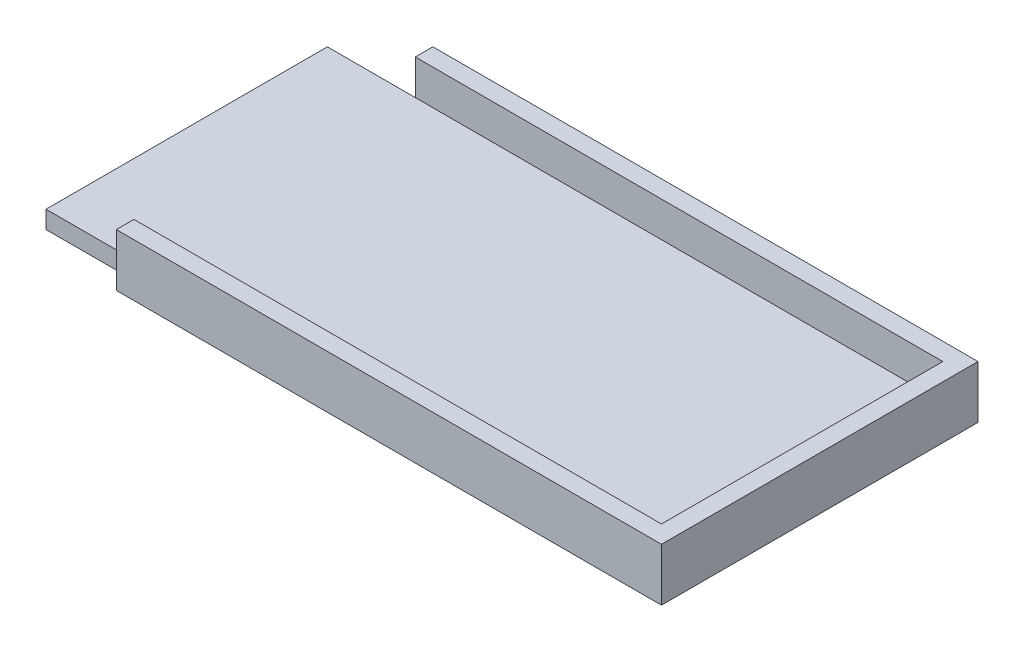
ISO-10303-21;
HEADER;
FILE_DESCRIPTION(('STEP AP214'),'2;1');
FILE_NAME('part.step','',(''),(''),'','','');
FILE_SCHEMA(('AUTOMOTIVE_DESIGN { 1 0 10303 214 1 1 1 1 }'));
ENDSEC;
DATA;
#1=APPLICATION_CONTEXT('core data for automotive mechanical design processes');
#2=APPLICATION_PROTOCOL_DEFINITION('international standard','automotive_design',2000,#1);
#3=PRODUCT_CONTEXT('',#1,'mechanical');
#4=PRODUCT('Part','Part','',(#3));
#5=PRODUCT_RELATED_PRODUCT_CATEGORY('part','',(#4));
#6=PRODUCT_DEFINITION_FORMATION('','',#4);
#7=PRODUCT_DEFINITION_CONTEXT('part definition',#1,'design');
#8=PRODUCT_DEFINITION('design','',#6,#7);
#9=PRODUCT_DEFINITION_SHAPE('','',#8);
#10=(LENGTH_UNIT() NAMED_UNIT(*) SI_UNIT(.MILLI.,.METRE.));
#11=(NAMED_UNIT(*) PLANE_ANGLE_UNIT() SI_UNIT($,.RADIAN.));
#12=(NAMED_UNIT(*) SI_UNIT($,.STERADIAN.) SOLID_ANGLE_UNIT());
#13=UNCERTAINTY_MEASURE_WITH_UNIT(LENGTH_MEASURE(1.E-05),#10,'distance_accuracy_value','');
#14=(GEOMETRIC_REPRESENTATION_CONTEXT(3) GLOBAL_UNCERTAINTY_ASSIGNED_CONTEXT((#13)) GLOBAL_UNIT_ASSIGNED_CONTEXT((#10,
#11,#12)) REPRESENTATION_CONTEXT('',''));
#15=CARTESIAN_POINT('',(0.,0.,0.));
#16=DIRECTION('',(0.,0.,1.));
#17=DIRECTION('',(1.,0.,0.));
#18=AXIS2_PLACEMENT_3D('',#15,#16,#17);
#19=CARTESIAN_POINT('',(-30.,2.,16.));
#20=DIRECTION('',(1.,0.,0.));
#21=DIRECTION('',(0.,0.,-1.));
#22=AXIS2_PLACEMENT_3D('',#19,#20,#21);
#23=PLANE('',#22);
#24=DIRECTION('',(0.,-1.,0.));
#25=VECTOR('',#24,1.);
#26=CARTESIAN_POINT('',(-30.,2.,-16.));
#27=LINE('',#26,#25);
#28=CARTESIAN_POINT('',(-30.,2.,-16.));
#29=VERTEX_POINT('',#28);
#30=CARTESIAN_POINT('',(-30.,0.,-16.));
#31=VERTEX_POINT('',#30);
#32=EDGE_CURVE('E194',#29,#31,#27,.T.);
#33=ORIENTED_EDGE('',*,*,#32,.F.);
#34=DIRECTION('',(0.,-1.,0.));
#35=VECTOR('',#34,1.);
#36=CARTESIAN_POINT('',(-30.,81.6937933157397,-16.));
#37=LINE('',#36,#35);
#38=CARTESIAN_POINT('',(-30.,6.00000000000001,-16.));
#39=VERTEX_POINT('',#38);
#40=EDGE_CURVE('E160',#39,#29,#37,.T.);
#41=ORIENTED_EDGE('',*,*,#40,.F.);
#42=DIRECTION('',(0.,0.,-1.));
#43=VECTOR('',#42,1.);
#44=CARTESIAN_POINT('',(-30.,6.00000000000001,-16.));
#45=LINE('',#44,#43);
#46=CARTESIAN_POINT('',(-30.,6.00000000000001,-18.));
#47=VERTEX_POINT('',#46);
#48=EDGE_CURVE('E163',#39,#47,#45,.T.);
#49=ORIENTED_EDGE('',*,*,#48,.T.);
#50=DIRECTION('',(0.,-1.,0.));
#51=VECTOR('',#50,1.);
#52=CARTESIAN_POINT('',(-30.,81.6937933157397,-18.));
#53=LINE('',#52,#51);
#54=CARTESIAN_POINT('',(-30.,0.,-18.));
#55=VERTEX_POINT('',#54);
#56=EDGE_CURVE('E164',#47,#55,#53,.T.);
#57=ORIENTED_EDGE('',*,*,#56,.T.);
#58=DIRECTION('',(0.,0.,1.));
#59=VECTOR('',#58,1.);
#60=CARTESIAN_POINT('',(-30.,0.,16.));
#61=LINE('',#60,#59);
#62=EDGE_CURVE('E39',#55,#31,#61,.T.);
#63=ORIENTED_EDGE('',*,*,#62,.T.);
#64=EDGE_LOOP('',(#33,#41,#49,#57,#63));
#65=FACE_BOUND('',#64,.T.);
#66=ADVANCED_FACE('F35',(#65),#23,.F.);
#67=DIRECTION('',(0.,-1.,0.));
#68=VECTOR('',#67,1.);
#69=CARTESIAN_POINT('',(-30.,81.6937933157397,16.));
#70=LINE('',#69,#68);
#71=CARTESIAN_POINT('',(-30.,6.00000000000001,16.));
#72=VERTEX_POINT('',#71);
#73=CARTESIAN_POINT('',(-30.,2.,16.));
#74=VERTEX_POINT('',#73);
#75=EDGE_CURVE('E140',#72,#74,#70,.T.);
#76=ORIENTED_EDGE('',*,*,#75,.T.);
#77=DIRECTION('',(0.,-1.,0.));
#78=VECTOR('',#77,1.);
#79=CARTESIAN_POINT('',(-30.,2.,16.));
#80=LINE('',#79,#78);
#81=CARTESIAN_POINT('',(-30.,0.,16.));
#82=VERTEX_POINT('',#81);
#83=EDGE_CURVE('E116',#74,#82,#80,.T.);
#84=ORIENTED_EDGE('',*,*,#83,.T.);
#85=CARTESIAN_POINT('',(-30.,0.,18.));
#86=VERTEX_POINT('',#85);
#87=EDGE_CURVE('E147',#82,#86,#61,.T.);
#88=ORIENTED_EDGE('',*,*,#87,.T.);
#89=DIRECTION('',(0.,-1.,0.));
#90=VECTOR('',#89,1.);
#91=CARTESIAN_POINT('',(-30.,81.6937933157397,18.));
#92=LINE('',#91,#90);
#93=CARTESIAN_POINT('',(-30.,6.00000000000001,18.));
#94=VERTEX_POINT('',#93);
#95=EDGE_CURVE('E149',#94,#86,#92,.T.);
#96=ORIENTED_EDGE('',*,*,#95,.F.);
#97=DIRECTION('',(0.,0.,-1.));
#98=VECTOR('',#97,1.);
#99=CARTESIAN_POINT('',(-30.,6.00000000000001,16.));
#100=LINE('',#99,#98);
#101=EDGE_CURVE('E146',#94,#72,#100,.T.);
#102=ORIENTED_EDGE('',*,*,#101,.T.);
#103=EDGE_LOOP('',(#76,#84,#88,#96,#102));
#104=FACE_BOUND('',#103,.T.);
#105=ADVANCED_FACE('F37',(#104),#23,.F.);
#106=CARTESIAN_POINT('',(0.,2.,0.));
#107=DIRECTION('',(0.,1.,0.));
#108=DIRECTION('',(0.,0.,1.));
#109=AXIS2_PLACEMENT_3D('',#106,#107,#108);
#110=PLANE('',#109);
#111=DIRECTION('',(-1.,0.,0.));
#112=VECTOR('',#111,1.);
#113=CARTESIAN_POINT('',(30.,2.,-16.));
#114=LINE('',#113,#112);
#115=CARTESIAN_POINT('',(30.,2.,-16.));
#116=VERTEX_POINT('',#115);
#117=EDGE_CURVE('E12',#116,#29,#114,.T.);
#118=ORIENTED_EDGE('',*,*,#117,.T.);
#119=DIRECTION('',(1.,0.,0.));
#120=VECTOR('',#119,1.);
#121=CARTESIAN_POINT('',(-30.,2.,-16.));
#122=LINE('',#121,#120);
#123=CARTESIAN_POINT('',(-40.,2.,-16.));
#124=VERTEX_POINT('',#123);
#125=EDGE_CURVE('E124',#124,#29,#122,.T.);
#126=ORIENTED_EDGE('',*,*,#125,.F.);
#127=DIRECTION('',(0.,0.,-1.));
#128=VECTOR('',#127,1.);
#129=CARTESIAN_POINT('',(-40.,2.,-16.));
#130=LINE('',#129,#128);
#131=CARTESIAN_POINT('',(-40.,2.,16.));
#132=VERTEX_POINT('',#131);
#133=EDGE_CURVE('E132',#132,#124,#130,.T.);
#134=ORIENTED_EDGE('',*,*,#133,.F.);
#135=DIRECTION('',(-1.,0.,0.));
#136=VECTOR('',#135,1.);
#137=CARTESIAN_POINT('',(-30.,2.,16.));
#138=LINE('',#137,#136);
#139=EDGE_CURVE('E119',#74,#132,#138,.T.);
#140=ORIENTED_EDGE('',*,*,#139,.F.);
#141=DIRECTION('',(1.,0.,0.));
#142=VECTOR('',#141,1.);
#143=CARTESIAN_POINT('',(30.,2.,16.));
#144=LINE('',#143,#142);
#145=CARTESIAN_POINT('',(30.,2.,16.));
#146=VERTEX_POINT('',#145);
#147=EDGE_CURVE('E129',#74,#146,#144,.T.);
#148=ORIENTED_EDGE('',*,*,#147,.T.);
#149=DIRECTION('',(0.,0.,-1.));
#150=VECTOR('',#149,1.);
#151=CARTESIAN_POINT('',(30.,2.,16.));
#152=LINE('',#151,#150);
#153=EDGE_CURVE('E44',#146,#116,#152,.T.);
#154=ORIENTED_EDGE('',*,*,#153,.T.);
#155=EDGE_LOOP('',(#118,#126,#134,#140,#148,#154));
#156=FACE_BOUND('',#155,.T.);
#157=ADVANCED_FACE('F128',(#156),#110,.T.);
#158=CARTESIAN_POINT('',(0.,0.,0.));
#159=DIRECTION('',(0.,1.,0.));
#160=DIRECTION('',(0.,0.,1.));
#161=AXIS2_PLACEMENT_3D('',#158,#159,#160);
#162=PLANE('',#161);
#163=ORIENTED_EDGE('',*,*,#62,.F.);
#164=DIRECTION('',(1.,0.,0.));
#165=VECTOR('',#164,1.);
#166=CARTESIAN_POINT('',(-30.,0.,-18.));
#167=LINE('',#166,#165);
#168=CARTESIAN_POINT('',(32.,0.,-18.));
#169=VERTEX_POINT('',#168);
#170=EDGE_CURVE('E190',#55,#169,#167,.T.);
#171=ORIENTED_EDGE('',*,*,#170,.T.);
#172=DIRECTION('',(0.,0.,1.));
#173=VECTOR('',#172,1.);
#174=CARTESIAN_POINT('',(32.,0.,-18.));
#175=LINE('',#174,#173);
#176=CARTESIAN_POINT('',(32.,0.,18.));
#177=VERTEX_POINT('',#176);
#178=EDGE_CURVE('E193',#169,#177,#175,.T.);
#179=ORIENTED_EDGE('',*,*,#178,.T.);
#180=DIRECTION('',(-1.,0.,0.));
#181=VECTOR('',#180,1.);
#182=CARTESIAN_POINT('',(32.,0.,18.));
#183=LINE('',#182,#181);
#184=EDGE_CURVE('E189',#177,#86,#183,.T.);
#185=ORIENTED_EDGE('',*,*,#184,.T.);
#186=ORIENTED_EDGE('',*,*,#87,.F.);
#187=DIRECTION('',(-1.,0.,0.));
#188=VECTOR('',#187,1.);
#189=CARTESIAN_POINT('',(-30.,0.,16.));
#190=LINE('',#189,#188);
#191=CARTESIAN_POINT('',(-40.,0.,16.));
#192=VERTEX_POINT('',#191);
#193=EDGE_CURVE('E51',#82,#192,#190,.T.);
#194=ORIENTED_EDGE('',*,*,#193,.T.);
#195=DIRECTION('',(0.,0.,-1.));
#196=VECTOR('',#195,1.);
#197=CARTESIAN_POINT('',(-40.,0.,-16.));
#198=LINE('',#197,#196);
#199=CARTESIAN_POINT('',(-40.,0.,-16.));
#200=VERTEX_POINT('',#199);
#201=EDGE_CURVE('E205',#192,#200,#198,.T.);
#202=ORIENTED_EDGE('',*,*,#201,.T.);
#203=DIRECTION('',(1.,0.,0.));
#204=VECTOR('',#203,1.);
#205=CARTESIAN_POINT('',(-30.,0.,-16.));
#206=LINE('',#205,#204);
#207=EDGE_CURVE('E133',#200,#31,#206,.T.);
#208=ORIENTED_EDGE('',*,*,#207,.T.);
#209=EDGE_LOOP('',(#163,#171,#179,#185,#186,#194,#202,#208));
#210=FACE_BOUND('',#209,.T.);
#211=ADVANCED_FACE('F223',(#210),#162,.F.);
#212=CARTESIAN_POINT('',(0.,6.,0.));
#213=DIRECTION('',(0.,1.,0.));
#214=DIRECTION('',(0.,0.,1.));
#215=AXIS2_PLACEMENT_3D('',#212,#213,#214);
#216=PLANE('',#215);
#217=ORIENTED_EDGE('',*,*,#101,.F.);
#218=DIRECTION('',(-1.,0.,0.));
#219=VECTOR('',#218,1.);
#220=CARTESIAN_POINT('',(32.,6.00000000000001,18.));
#221=LINE('',#220,#219);
#222=CARTESIAN_POINT('',(32.,6.00000000000001,18.));
#223=VERTEX_POINT('',#222);
#224=EDGE_CURVE('E173',#223,#94,#221,.T.);
#225=ORIENTED_EDGE('',*,*,#224,.F.);
#226=DIRECTION('',(0.,0.,1.));
#227=VECTOR('',#226,1.);
#228=CARTESIAN_POINT('',(32.,6.00000000000001,-18.));
#229=LINE('',#228,#227);
#230=CARTESIAN_POINT('',(32.,6.00000000000001,-18.));
#231=VERTEX_POINT('',#230);
#232=EDGE_CURVE('E170',#231,#223,#229,.T.);
#233=ORIENTED_EDGE('',*,*,#232,.F.);
#234=DIRECTION('',(1.,0.,0.));
#235=VECTOR('',#234,1.);
#236=CARTESIAN_POINT('',(-30.,6.00000000000001,-18.));
#237=LINE('',#236,#235);
#238=EDGE_CURVE('E167',#47,#231,#237,.T.);
#239=ORIENTED_EDGE('',*,*,#238,.F.);
#240=ORIENTED_EDGE('',*,*,#48,.F.);
#241=DIRECTION('',(-1.,0.,0.));
#242=VECTOR('',#241,1.);
#243=CARTESIAN_POINT('',(-30.,6.00000000000001,-16.));
#244=LINE('',#243,#242);
#245=CARTESIAN_POINT('',(30.,6.00000000000001,-16.));
#246=VERTEX_POINT('',#245);
#247=EDGE_CURVE('E159',#246,#39,#244,.T.);
#248=ORIENTED_EDGE('',*,*,#247,.F.);
#249=DIRECTION('',(0.,0.,-1.));
#250=VECTOR('',#249,1.);
#251=CARTESIAN_POINT('',(30.,6.00000000000001,-16.));
#252=LINE('',#251,#250);
#253=CARTESIAN_POINT('',(30.,6.00000000000001,16.));
#254=VERTEX_POINT('',#253);
#255=EDGE_CURVE('E154',#254,#246,#252,.T.);
#256=ORIENTED_EDGE('',*,*,#255,.F.);
#257=DIRECTION('',(1.,0.,0.));
#258=VECTOR('',#257,1.);
#259=CARTESIAN_POINT('',(30.,6.00000000000001,16.));
#260=LINE('',#259,#258);
#261=EDGE_CURVE('E155',#72,#254,#260,.T.);
#262=ORIENTED_EDGE('',*,*,#261,.F.);
#263=EDGE_LOOP('',(#217,#225,#233,#239,#240,#248,#256,#262));
#264=FACE_BOUND('',#263,.T.);
#265=ADVANCED_FACE('F229',(#264),#216,.T.);
#266=CARTESIAN_POINT('',(30.,81.6937933157397,16.));
#267=DIRECTION('',(0.,0.,-1.));
#268=DIRECTION('',(-1.,0.,0.));
#269=AXIS2_PLACEMENT_3D('',#266,#267,#268);
#270=PLANE('',#269);
#271=DIRECTION('',(0.,-1.,0.));
#272=VECTOR('',#271,1.);
#273=CARTESIAN_POINT('',(30.,81.6937933157397,16.));
#274=LINE('',#273,#272);
#275=EDGE_CURVE('E142',#254,#146,#274,.T.);
#276=ORIENTED_EDGE('',*,*,#275,.T.);
#277=ORIENTED_EDGE('',*,*,#147,.F.);
#278=ORIENTED_EDGE('',*,*,#75,.F.);
#279=ORIENTED_EDGE('',*,*,#261,.T.);
#280=EDGE_LOOP('',(#276,#277,#278,#279));
#281=FACE_BOUND('',#280,.T.);
#282=ADVANCED_FACE('F138',(#281),#270,.T.);
#283=CARTESIAN_POINT('',(30.,81.6937933157397,-16.));
#284=DIRECTION('',(-1.,0.,0.));
#285=DIRECTION('',(0.,0.,1.));
#286=AXIS2_PLACEMENT_3D('',#283,#284,#285);
#287=PLANE('',#286);
#288=DIRECTION('',(0.,-1.,0.));
#289=VECTOR('',#288,1.);
#290=CARTESIAN_POINT('',(30.,81.6937933157397,-16.));
#291=LINE('',#290,#289);
#292=EDGE_CURVE('E156',#246,#116,#291,.T.);
#293=ORIENTED_EDGE('',*,*,#292,.T.);
#294=ORIENTED_EDGE('',*,*,#153,.F.);
#295=ORIENTED_EDGE('',*,*,#275,.F.);
#296=ORIENTED_EDGE('',*,*,#255,.T.);
#297=EDGE_LOOP('',(#293,#294,#295,#296));
#298=FACE_BOUND('',#297,.T.);
#299=ADVANCED_FACE('F233',(#298),#287,.T.);
#300=CARTESIAN_POINT('',(-30.,81.6937933157397,-16.));
#301=DIRECTION('',(0.,0.,1.));
#302=DIRECTION('',(1.,0.,0.));
#303=AXIS2_PLACEMENT_3D('',#300,#301,#302);
#304=PLANE('',#303);
#305=ORIENTED_EDGE('',*,*,#40,.T.);
#306=ORIENTED_EDGE('',*,*,#117,.F.);
#307=ORIENTED_EDGE('',*,*,#292,.F.);
#308=ORIENTED_EDGE('',*,*,#247,.T.);
#309=EDGE_LOOP('',(#305,#306,#307,#308));
#310=FACE_BOUND('',#309,.T.);
#311=ADVANCED_FACE('F235',(#310),#304,.T.);
#312=CARTESIAN_POINT('',(-30.,81.6937933157397,-18.));
#313=DIRECTION('',(0.,0.,-1.));
#314=DIRECTION('',(-1.,0.,0.));
#315=AXIS2_PLACEMENT_3D('',#312,#313,#314);
#316=PLANE('',#315);
#317=ORIENTED_EDGE('',*,*,#56,.F.);
#318=ORIENTED_EDGE('',*,*,#238,.T.);
#319=DIRECTION('',(0.,-1.,0.));
#320=VECTOR('',#319,1.);
#321=CARTESIAN_POINT('',(32.,81.6937933157397,-18.));
#322=LINE('',#321,#320);
#323=EDGE_CURVE('E168',#231,#169,#322,.T.);
#324=ORIENTED_EDGE('',*,*,#323,.T.);
#325=ORIENTED_EDGE('',*,*,#170,.F.);
#326=EDGE_LOOP('',(#317,#318,#324,#325));
#327=FACE_BOUND('',#326,.T.);
#328=ADVANCED_FACE('F237',(#327),#316,.T.);
#329=CARTESIAN_POINT('',(32.,81.6937933157397,-18.));
#330=DIRECTION('',(1.,0.,0.));
#331=DIRECTION('',(0.,0.,-1.));
#332=AXIS2_PLACEMENT_3D('',#329,#330,#331);
#333=PLANE('',#332);
#334=ORIENTED_EDGE('',*,*,#323,.F.);
#335=ORIENTED_EDGE('',*,*,#232,.T.);
#336=DIRECTION('',(0.,-1.,0.));
#337=VECTOR('',#336,1.);
#338=CARTESIAN_POINT('',(32.,81.6937933157397,18.));
#339=LINE('',#338,#337);
#340=EDGE_CURVE('E171',#223,#177,#339,.T.);
#341=ORIENTED_EDGE('',*,*,#340,.T.);
#342=ORIENTED_EDGE('',*,*,#178,.F.);
#343=EDGE_LOOP('',(#334,#335,#341,#342));
#344=FACE_BOUND('',#343,.T.);
#345=ADVANCED_FACE('F243',(#344),#333,.T.);
#346=CARTESIAN_POINT('',(32.,81.6937933157397,18.));
#347=DIRECTION('',(0.,0.,1.));
#348=DIRECTION('',(1.,0.,0.));
#349=AXIS2_PLACEMENT_3D('',#346,#347,#348);
#350=PLANE('',#349);
#351=ORIENTED_EDGE('',*,*,#340,.F.);
#352=ORIENTED_EDGE('',*,*,#224,.T.);
#353=ORIENTED_EDGE('',*,*,#95,.T.);
#354=ORIENTED_EDGE('',*,*,#184,.F.);
#355=EDGE_LOOP('',(#351,#352,#353,#354));
#356=FACE_BOUND('',#355,.T.);
#357=ADVANCED_FACE('F227',(#356),#350,.T.);
#358=CARTESIAN_POINT('',(-30.,2.,-16.));
#359=DIRECTION('',(0.,0.,-1.));
#360=DIRECTION('',(-1.,0.,0.));
#361=AXIS2_PLACEMENT_3D('',#358,#359,#360);
#362=PLANE('',#361);
#363=ORIENTED_EDGE('',*,*,#207,.F.);
#364=DIRECTION('',(0.,-1.,0.));
#365=VECTOR('',#364,1.);
#366=CARTESIAN_POINT('',(-40.,2.,-16.));
#367=LINE('',#366,#365);
#368=EDGE_CURVE('E200',#124,#200,#367,.T.);
#369=ORIENTED_EDGE('',*,*,#368,.F.);
#370=ORIENTED_EDGE('',*,*,#125,.T.);
#371=ORIENTED_EDGE('',*,*,#32,.T.);
#372=EDGE_LOOP('',(#363,#369,#370,#371));
#373=FACE_BOUND('',#372,.T.);
#374=ADVANCED_FACE('F216',(#373),#362,.T.);
#375=CARTESIAN_POINT('',(-40.,2.,-16.));
#376=DIRECTION('',(-1.,0.,0.));
#377=DIRECTION('',(0.,0.,1.));
#378=AXIS2_PLACEMENT_3D('',#375,#376,#377);
#379=PLANE('',#378);
#380=ORIENTED_EDGE('',*,*,#201,.F.);
#381=DIRECTION('',(0.,-1.,0.));
#382=VECTOR('',#381,1.);
#383=CARTESIAN_POINT('',(-40.,2.,16.));
#384=LINE('',#383,#382);
#385=EDGE_CURVE('E123',#132,#192,#384,.T.);
#386=ORIENTED_EDGE('',*,*,#385,.F.);
#387=ORIENTED_EDGE('',*,*,#133,.T.);
#388=ORIENTED_EDGE('',*,*,#368,.T.);
#389=EDGE_LOOP('',(#380,#386,#387,#388));
#390=FACE_BOUND('',#389,.T.);
#391=ADVANCED_FACE('F212',(#390),#379,.T.);
#392=CARTESIAN_POINT('',(-30.,2.,16.));
#393=DIRECTION('',(0.,0.,1.));
#394=DIRECTION('',(1.,0.,0.));
#395=AXIS2_PLACEMENT_3D('',#392,#393,#394);
#396=PLANE('',#395);
#397=ORIENTED_EDGE('',*,*,#193,.F.);
#398=ORIENTED_EDGE('',*,*,#83,.F.);
#399=ORIENTED_EDGE('',*,*,#139,.T.);
#400=ORIENTED_EDGE('',*,*,#385,.T.);
#401=EDGE_LOOP('',(#397,#398,#399,#400));
#402=FACE_BOUND('',#401,.T.);
#403=ADVANCED_FACE('F118',(#402),#396,.T.);
#404=CLOSED_SHELL('',(#66,#105,#157,#211,#265,#282,#299,#311,#328,#345,#357,#374,#391,#403));
#405=MANIFOLD_SOLID_BREP('B2',#404);
#406=ADVANCED_BREP_SHAPE_REPRESENTATION('',(#18,#405),#14);
#407=SHAPE_DEFINITION_REPRESENTATION(#9,#406);
ENDSEC;
END-ISO-10303-21;
